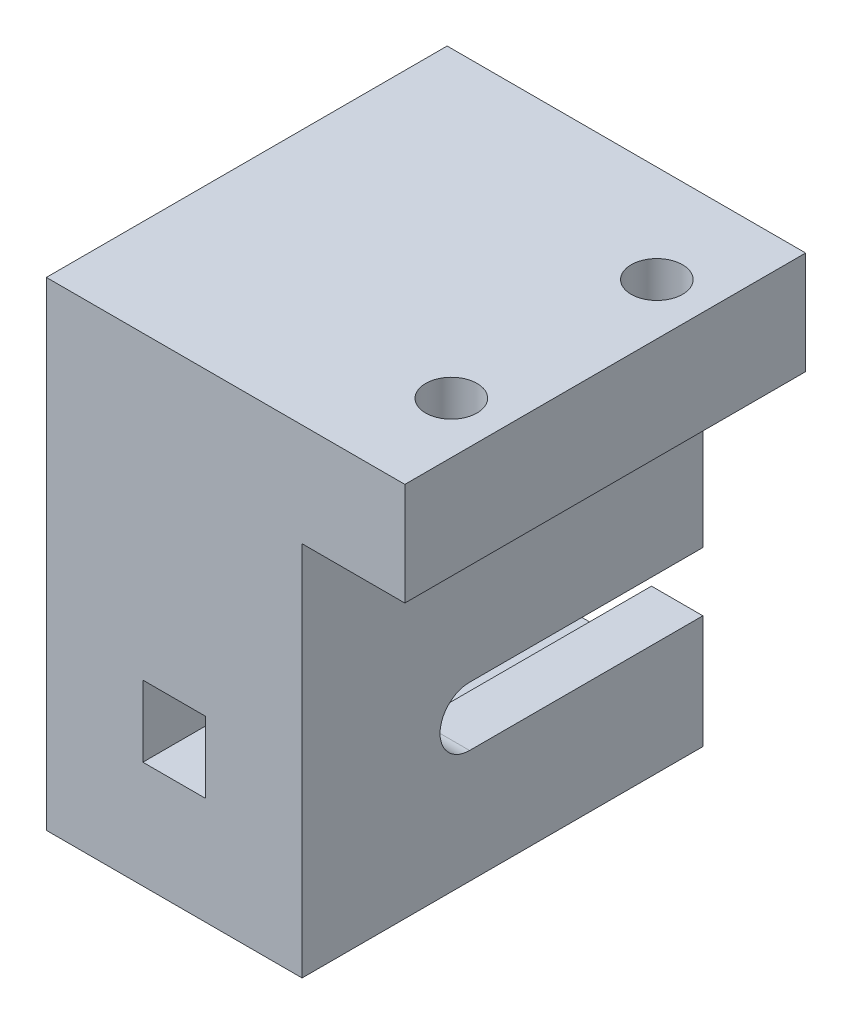
ISO-10303-21;
HEADER;
FILE_DESCRIPTION(('STEP AP214'),'2;1');
FILE_NAME('part.step','',(''),(''),'','','');
FILE_SCHEMA(('AUTOMOTIVE_DESIGN { 1 0 10303 214 1 1 1 1 }'));
ENDSEC;
DATA;
#1=APPLICATION_CONTEXT('core data for automotive mechanical design processes');
#2=APPLICATION_PROTOCOL_DEFINITION('international standard','automotive_design',2000,#1);
#3=PRODUCT_CONTEXT('',#1,'mechanical');
#4=PRODUCT('Part','Part','',(#3));
#5=PRODUCT_RELATED_PRODUCT_CATEGORY('part','',(#4));
#6=PRODUCT_DEFINITION_FORMATION('','',#4);
#7=PRODUCT_DEFINITION_CONTEXT('part definition',#1,'design');
#8=PRODUCT_DEFINITION('design','',#6,#7);
#9=PRODUCT_DEFINITION_SHAPE('','',#8);
#10=(LENGTH_UNIT() NAMED_UNIT(*) SI_UNIT(.MILLI.,.METRE.));
#11=(NAMED_UNIT(*) PLANE_ANGLE_UNIT() SI_UNIT($,.RADIAN.));
#12=(NAMED_UNIT(*) SI_UNIT($,.STERADIAN.) SOLID_ANGLE_UNIT());
#13=UNCERTAINTY_MEASURE_WITH_UNIT(LENGTH_MEASURE(1.E-05),#10,'distance_accuracy_value','');
#14=(GEOMETRIC_REPRESENTATION_CONTEXT(3) GLOBAL_UNCERTAINTY_ASSIGNED_CONTEXT((#13)) GLOBAL_UNIT_ASSIGNED_CONTEXT((#10,
#11,#12)) REPRESENTATION_CONTEXT('',''));
#15=CARTESIAN_POINT('',(0.,0.,0.));
#16=DIRECTION('',(0.,0.,1.));
#17=DIRECTION('',(1.,0.,0.));
#18=AXIS2_PLACEMENT_3D('',#15,#16,#17);
#19=CARTESIAN_POINT('',(28.5,0.,0.));
#20=DIRECTION('',(1.,0.,0.));
#21=DIRECTION('',(0.,0.,-1.));
#22=AXIS2_PLACEMENT_3D('',#19,#20,#21);
#23=PLANE('',#22);
#24=DIRECTION('',(0.,-1.,0.));
#25=VECTOR('',#24,1.);
#26=CARTESIAN_POINT('',(28.5,28.826000006,49.525));
#27=LINE('',#26,#25);
#28=CARTESIAN_POINT('',(28.5,41.526000006,49.525));
#29=VERTEX_POINT('',#28);
#30=CARTESIAN_POINT('',(28.5,28.826000006,49.525));
#31=VERTEX_POINT('',#30);
#32=EDGE_CURVE('E255',#29,#31,#27,.T.);
#33=ORIENTED_EDGE('',*,*,#32,.T.);
#34=DIRECTION('',(0.,0.,1.));
#35=VECTOR('',#34,1.);
#36=CARTESIAN_POINT('',(28.5,28.826000006,49.525));
#37=LINE('',#36,#35);
#38=CARTESIAN_POINT('',(28.5,28.826000006,0.));
#39=VERTEX_POINT('',#38);
#40=EDGE_CURVE('E219',#39,#31,#37,.T.);
#41=ORIENTED_EDGE('',*,*,#40,.F.);
#42=DIRECTION('',(0.,1.,0.));
#43=VECTOR('',#42,1.);
#44=CARTESIAN_POINT('',(28.5,28.826000006,0.));
#45=LINE('',#44,#43);
#46=CARTESIAN_POINT('',(28.5,41.526000006,0.));
#47=VERTEX_POINT('',#46);
#48=EDGE_CURVE('E218',#39,#47,#45,.T.);
#49=ORIENTED_EDGE('',*,*,#48,.T.);
#50=DIRECTION('',(0.,0.,-1.));
#51=VECTOR('',#50,1.);
#52=CARTESIAN_POINT('',(28.5,41.526000006,0.));
#53=LINE('',#52,#51);
#54=EDGE_CURVE('E242',#29,#47,#53,.T.);
#55=ORIENTED_EDGE('',*,*,#54,.F.);
#56=EDGE_LOOP('',(#33,#41,#49,#55));
#57=FACE_BOUND('',#56,.T.);
#58=ADVANCED_FACE('F43',(#57),#23,.T.);
#59=CARTESIAN_POINT('',(0.,0.,0.));
#60=DIRECTION('',(0.,0.,-1.));
#61=DIRECTION('',(-1.,0.,0.));
#62=AXIS2_PLACEMENT_3D('',#59,#60,#61);
#63=PLANE('',#62);
#64=DIRECTION('',(1.,0.,0.));
#65=VECTOR('',#64,1.);
#66=CARTESIAN_POINT('',(15.8,28.826000006,0.));
#67=LINE('',#66,#65);
#68=CARTESIAN_POINT('',(15.8,28.826000006,0.));
#69=VERTEX_POINT('',#68);
#70=EDGE_CURVE('E210',#69,#39,#67,.T.);
#71=ORIENTED_EDGE('',*,*,#70,.F.);
#72=DIRECTION('',(0.,1.,0.));
#73=VECTOR('',#72,1.);
#74=CARTESIAN_POINT('',(15.8,-17.650000006,0.));
#75=LINE('',#74,#73);
#76=CARTESIAN_POINT('',(15.8,3.65,0.));
#77=VERTEX_POINT('',#76);
#78=EDGE_CURVE('E192',#77,#69,#75,.T.);
#79=ORIENTED_EDGE('',*,*,#78,.F.);
#80=DIRECTION('',(1.,0.,0.));
#81=VECTOR('',#80,1.);
#82=CARTESIAN_POINT('',(-15.95,3.65,0.));
#83=LINE('',#82,#81);
#84=CARTESIAN_POINT('',(9.45,3.65,0.));
#85=VERTEX_POINT('',#84);
#86=EDGE_CURVE('E270',#85,#77,#83,.T.);
#87=ORIENTED_EDGE('',*,*,#86,.F.);
#88=DIRECTION('',(0.,1.,0.));
#89=VECTOR('',#88,1.);
#90=CARTESIAN_POINT('',(9.45,-11.300000006,0.));
#91=LINE('',#90,#89);
#92=CARTESIAN_POINT('',(9.45,11.300000006,0.));
#93=VERTEX_POINT('',#92);
#94=EDGE_CURVE('E312',#85,#93,#91,.T.);
#95=ORIENTED_EDGE('',*,*,#94,.T.);
#96=DIRECTION('',(-1.,0.,0.));
#97=VECTOR('',#96,1.);
#98=CARTESIAN_POINT('',(-9.45,11.300000006,0.));
#99=LINE('',#98,#97);
#100=CARTESIAN_POINT('',(-9.45,11.300000006,0.));
#101=VERTEX_POINT('',#100);
#102=EDGE_CURVE('E330',#93,#101,#99,.T.);
#103=ORIENTED_EDGE('',*,*,#102,.T.);
#104=DIRECTION('',(0.,-1.,0.));
#105=VECTOR('',#104,1.);
#106=CARTESIAN_POINT('',(-9.45,-11.300000006,0.));
#107=LINE('',#106,#105);
#108=CARTESIAN_POINT('',(-9.45,3.65,0.));
#109=VERTEX_POINT('',#108);
#110=EDGE_CURVE('E334',#101,#109,#107,.T.);
#111=ORIENTED_EDGE('',*,*,#110,.T.);
#112=CARTESIAN_POINT('',(-15.8,3.65,0.));
#113=VERTEX_POINT('',#112);
#114=EDGE_CURVE('E269',#113,#109,#83,.T.);
#115=ORIENTED_EDGE('',*,*,#114,.F.);
#116=DIRECTION('',(0.,-1.,0.));
#117=VECTOR('',#116,1.);
#118=CARTESIAN_POINT('',(-15.8,-17.650000006,0.));
#119=LINE('',#118,#117);
#120=CARTESIAN_POINT('',(-15.8,41.526000006,0.));
#121=VERTEX_POINT('',#120);
#122=EDGE_CURVE('E350',#121,#113,#119,.T.);
#123=ORIENTED_EDGE('',*,*,#122,.F.);
#124=DIRECTION('',(-1.,0.,0.));
#125=VECTOR('',#124,1.);
#126=CARTESIAN_POINT('',(-15.8,41.526000006,0.));
#127=LINE('',#126,#125);
#128=EDGE_CURVE('E245',#47,#121,#127,.T.);
#129=ORIENTED_EDGE('',*,*,#128,.F.);
#130=ORIENTED_EDGE('',*,*,#48,.F.);
#131=EDGE_LOOP('',(#71,#79,#87,#95,#103,#111,#115,#123,#129,#130));
#132=FACE_BOUND('',#131,.T.);
#133=ADVANCED_FACE('F216',(#132),#63,.T.);
#134=CARTESIAN_POINT('',(0.,0.,40.));
#135=DIRECTION('',(0.,0.,1.));
#136=DIRECTION('',(1.,0.,0.));
#137=AXIS2_PLACEMENT_3D('',#134,#135,#136);
#138=PLANE('',#137);
#139=DIRECTION('',(0.,1.,0.));
#140=VECTOR('',#139,1.);
#141=CARTESIAN_POINT('',(9.45,-11.300000006,40.));
#142=LINE('',#141,#140);
#143=CARTESIAN_POINT('',(9.45,-11.300000006,40.));
#144=VERTEX_POINT('',#143);
#145=CARTESIAN_POINT('',(9.45,11.300000006,40.));
#146=VERTEX_POINT('',#145);
#147=EDGE_CURVE('E313',#144,#146,#142,.T.);
#148=ORIENTED_EDGE('',*,*,#147,.F.);
#149=DIRECTION('',(1.,0.,0.));
#150=VECTOR('',#149,1.);
#151=CARTESIAN_POINT('',(-9.45,-11.300000006,40.));
#152=LINE('',#151,#150);
#153=CARTESIAN_POINT('',(-9.45,-11.300000006,40.));
#154=VERTEX_POINT('',#153);
#155=EDGE_CURVE('E323',#154,#144,#152,.T.);
#156=ORIENTED_EDGE('',*,*,#155,.F.);
#157=DIRECTION('',(0.,-1.,0.));
#158=VECTOR('',#157,1.);
#159=CARTESIAN_POINT('',(-9.45,-11.300000006,40.));
#160=LINE('',#159,#158);
#161=CARTESIAN_POINT('',(-9.45,11.300000006,40.));
#162=VERTEX_POINT('',#161);
#163=EDGE_CURVE('E320',#162,#154,#160,.T.);
#164=ORIENTED_EDGE('',*,*,#163,.F.);
#165=DIRECTION('',(-1.,0.,0.));
#166=VECTOR('',#165,1.);
#167=CARTESIAN_POINT('',(-9.45,11.300000006,40.));
#168=LINE('',#167,#166);
#169=EDGE_CURVE('E316',#146,#162,#168,.T.);
#170=ORIENTED_EDGE('',*,*,#169,.F.);
#171=EDGE_LOOP('',(#148,#156,#164,#170));
#172=FACE_BOUND('',#171,.T.);
#173=DIRECTION('',(0.,1.,0.));
#174=VECTOR('',#173,1.);
#175=CARTESIAN_POINT('',(-3.8745434853159,4.39429931871205,40.));
#176=LINE('',#175,#174);
#177=CARTESIAN_POINT('',(-3.8745434853159,-4.39429931871205,40.));
#178=VERTEX_POINT('',#177);
#179=CARTESIAN_POINT('',(-3.8745434853159,4.39429931871205,40.));
#180=VERTEX_POINT('',#179);
#181=EDGE_CURVE('E285',#178,#180,#176,.T.);
#182=ORIENTED_EDGE('',*,*,#181,.F.);
#183=DIRECTION('',(-1.,0.,0.));
#184=VECTOR('',#183,1.);
#185=CARTESIAN_POINT('',(3.8745434853159,-4.39429931871205,40.));
#186=LINE('',#185,#184);
#187=CARTESIAN_POINT('',(3.8745434853159,-4.39429931871205,40.));
#188=VERTEX_POINT('',#187);
#189=EDGE_CURVE('E293',#188,#178,#186,.T.);
#190=ORIENTED_EDGE('',*,*,#189,.F.);
#191=DIRECTION('',(0.,-1.,0.));
#192=VECTOR('',#191,1.);
#193=CARTESIAN_POINT('',(3.8745434853159,4.39429931871205,40.));
#194=LINE('',#193,#192);
#195=CARTESIAN_POINT('',(3.8745434853159,4.39429931871205,40.));
#196=VERTEX_POINT('',#195);
#197=EDGE_CURVE('E291',#196,#188,#194,.T.);
#198=ORIENTED_EDGE('',*,*,#197,.F.);
#199=DIRECTION('',(1.,0.,0.));
#200=VECTOR('',#199,1.);
#201=CARTESIAN_POINT('',(3.8745434853159,4.39429931871205,40.));
#202=LINE('',#201,#200);
#203=EDGE_CURVE('E288',#180,#196,#202,.T.);
#204=ORIENTED_EDGE('',*,*,#203,.F.);
#205=EDGE_LOOP('',(#182,#190,#198,#204));
#206=FACE_BOUND('',#205,.T.);
#207=ADVANCED_FACE('F391',(#172,#206),#138,.F.);
#208=DIRECTION('',(1.,0.,0.));
#209=VECTOR('',#208,1.);
#210=CARTESIAN_POINT('',(-15.95,-3.65,0.));
#211=LINE('',#210,#209);
#212=CARTESIAN_POINT('',(9.45,-3.65,0.));
#213=VERTEX_POINT('',#212);
#214=CARTESIAN_POINT('',(15.8,-3.65,0.));
#215=VERTEX_POINT('',#214);
#216=EDGE_CURVE('E65',#213,#215,#211,.T.);
#217=ORIENTED_EDGE('',*,*,#216,.T.);
#218=CARTESIAN_POINT('',(15.8,-17.650000006,0.));
#219=VERTEX_POINT('',#218);
#220=EDGE_CURVE('E204',#219,#215,#75,.T.);
#221=ORIENTED_EDGE('',*,*,#220,.F.);
#222=DIRECTION('',(1.,0.,0.));
#223=VECTOR('',#222,1.);
#224=CARTESIAN_POINT('',(-15.8,-17.650000006,0.));
#225=LINE('',#224,#223);
#226=CARTESIAN_POINT('',(-15.8,-17.650000006,0.));
#227=VERTEX_POINT('',#226);
#228=EDGE_CURVE('E205',#227,#219,#225,.T.);
#229=ORIENTED_EDGE('',*,*,#228,.F.);
#230=CARTESIAN_POINT('',(-15.8,-3.65,0.));
#231=VERTEX_POINT('',#230);
#232=EDGE_CURVE('E349',#231,#227,#119,.T.);
#233=ORIENTED_EDGE('',*,*,#232,.F.);
#234=CARTESIAN_POINT('',(-9.45,-3.65,0.));
#235=VERTEX_POINT('',#234);
#236=EDGE_CURVE('E272',#231,#235,#211,.T.);
#237=ORIENTED_EDGE('',*,*,#236,.T.);
#238=CARTESIAN_POINT('',(-9.45,-11.300000006,0.));
#239=VERTEX_POINT('',#238);
#240=EDGE_CURVE('E333',#235,#239,#107,.T.);
#241=ORIENTED_EDGE('',*,*,#240,.T.);
#242=DIRECTION('',(1.,0.,0.));
#243=VECTOR('',#242,1.);
#244=CARTESIAN_POINT('',(-9.45,-11.300000006,0.));
#245=LINE('',#244,#243);
#246=CARTESIAN_POINT('',(9.45,-11.300000006,0.));
#247=VERTEX_POINT('',#246);
#248=EDGE_CURVE('E317',#239,#247,#245,.T.);
#249=ORIENTED_EDGE('',*,*,#248,.T.);
#250=EDGE_CURVE('E327',#247,#213,#91,.T.);
#251=ORIENTED_EDGE('',*,*,#250,.T.);
#252=EDGE_LOOP('',(#217,#221,#229,#233,#237,#241,#249,#251));
#253=FACE_BOUND('',#252,.T.);
#254=ADVANCED_FACE('F400',(#253),#63,.T.);
#255=CARTESIAN_POINT('',(-15.8,-17.650000006,40.));
#256=DIRECTION('',(1.,0.,0.));
#257=DIRECTION('',(0.,0.,-1.));
#258=AXIS2_PLACEMENT_3D('',#255,#256,#257);
#259=PLANE('',#258);
#260=DIRECTION('',(0.,0.,1.));
#261=VECTOR('',#260,1.);
#262=CARTESIAN_POINT('',(-15.8,3.65,40.));
#263=LINE('',#262,#261);
#264=CARTESIAN_POINT('',(-15.8,3.65,23.6314235617938));
#265=VERTEX_POINT('',#264);
#266=EDGE_CURVE('E280',#113,#265,#263,.T.);
#267=ORIENTED_EDGE('',*,*,#266,.T.);
#268=CARTESIAN_POINT('',(-15.8,0.,28.8275759845004));
#269=DIRECTION('',(-1.,0.,0.));
#270=DIRECTION('',(0.,0.,1.));
#271=AXIS2_PLACEMENT_3D('',#268,#269,#270);
#272=CIRCLE('',#271,6.35);
#273=CARTESIAN_POINT('',(-15.8,-3.65,23.6314235617938));
#274=VERTEX_POINT('',#273);
#275=EDGE_CURVE('E58',#274,#265,#272,.T.);
#276=ORIENTED_EDGE('',*,*,#275,.F.);
#277=DIRECTION('',(0.,0.,-1.));
#278=VECTOR('',#277,1.);
#279=CARTESIAN_POINT('',(-15.8,-3.65,40.));
#280=LINE('',#279,#278);
#281=EDGE_CURVE('E276',#274,#231,#280,.T.);
#282=ORIENTED_EDGE('',*,*,#281,.T.);
#283=ORIENTED_EDGE('',*,*,#232,.T.);
#284=DIRECTION('',(0.,0.,-1.));
#285=VECTOR('',#284,1.);
#286=CARTESIAN_POINT('',(-15.8,-17.650000006,40.));
#287=LINE('',#286,#285);
#288=CARTESIAN_POINT('',(-15.8,-17.650000006,49.525));
#289=VERTEX_POINT('',#288);
#290=EDGE_CURVE('E357',#289,#227,#287,.T.);
#291=ORIENTED_EDGE('',*,*,#290,.F.);
#292=DIRECTION('',(0.,-1.,0.));
#293=VECTOR('',#292,1.);
#294=CARTESIAN_POINT('',(-15.8,0.,49.525));
#295=LINE('',#294,#293);
#296=CARTESIAN_POINT('',(-15.8,41.526000006,49.525));
#297=VERTEX_POINT('',#296);
#298=EDGE_CURVE('E299',#297,#289,#295,.T.);
#299=ORIENTED_EDGE('',*,*,#298,.F.);
#300=DIRECTION('',(0.,0.,1.));
#301=VECTOR('',#300,1.);
#302=CARTESIAN_POINT('',(-15.8,41.526000006,0.));
#303=LINE('',#302,#301);
#304=EDGE_CURVE('E234',#121,#297,#303,.T.);
#305=ORIENTED_EDGE('',*,*,#304,.F.);
#306=ORIENTED_EDGE('',*,*,#122,.T.);
#307=EDGE_LOOP('',(#267,#276,#282,#283,#291,#299,#305,#306));
#308=FACE_BOUND('',#307,.T.);
#309=ADVANCED_FACE('F45',(#308),#259,.F.);
#310=CARTESIAN_POINT('',(-15.8,-17.650000006,40.));
#311=DIRECTION('',(0.,1.,0.));
#312=DIRECTION('',(0.,0.,1.));
#313=AXIS2_PLACEMENT_3D('',#310,#311,#312);
#314=PLANE('',#313);
#315=ORIENTED_EDGE('',*,*,#228,.T.);
#316=DIRECTION('',(0.,0.,-1.));
#317=VECTOR('',#316,1.);
#318=CARTESIAN_POINT('',(15.8,-17.650000006,40.));
#319=LINE('',#318,#317);
#320=CARTESIAN_POINT('',(15.8,-17.650000006,49.525));
#321=VERTEX_POINT('',#320);
#322=EDGE_CURVE('E354',#321,#219,#319,.T.);
#323=ORIENTED_EDGE('',*,*,#322,.F.);
#324=DIRECTION('',(1.,0.,0.));
#325=VECTOR('',#324,1.);
#326=CARTESIAN_POINT('',(0.,-17.650000006,49.525));
#327=LINE('',#326,#325);
#328=EDGE_CURVE('E307',#289,#321,#327,.T.);
#329=ORIENTED_EDGE('',*,*,#328,.F.);
#330=ORIENTED_EDGE('',*,*,#290,.T.);
#331=EDGE_LOOP('',(#315,#323,#329,#330));
#332=FACE_BOUND('',#331,.T.);
#333=ADVANCED_FACE('F485',(#332),#314,.F.);
#334=CARTESIAN_POINT('',(15.8,-17.650000006,40.));
#335=DIRECTION('',(-1.,0.,0.));
#336=DIRECTION('',(0.,0.,1.));
#337=AXIS2_PLACEMENT_3D('',#334,#335,#336);
#338=PLANE('',#337);
#339=ORIENTED_EDGE('',*,*,#78,.T.);
#340=DIRECTION('',(0.,0.,-1.));
#341=VECTOR('',#340,1.);
#342=CARTESIAN_POINT('',(15.8,28.826000006,49.525));
#343=LINE('',#342,#341);
#344=CARTESIAN_POINT('',(15.8,28.826000006,49.525));
#345=VERTEX_POINT('',#344);
#346=EDGE_CURVE('E196',#345,#69,#343,.T.);
#347=ORIENTED_EDGE('',*,*,#346,.F.);
#348=DIRECTION('',(0.,1.,0.));
#349=VECTOR('',#348,1.);
#350=CARTESIAN_POINT('',(15.8,0.,49.525));
#351=LINE('',#350,#349);
#352=EDGE_CURVE('E310',#321,#345,#351,.T.);
#353=ORIENTED_EDGE('',*,*,#352,.F.);
#354=ORIENTED_EDGE('',*,*,#322,.T.);
#355=ORIENTED_EDGE('',*,*,#220,.T.);
#356=DIRECTION('',(0.,0.,-1.));
#357=VECTOR('',#356,1.);
#358=CARTESIAN_POINT('',(15.8,-3.65,0.));
#359=LINE('',#358,#357);
#360=CARTESIAN_POINT('',(15.8,-3.65,28.8275759845004));
#361=VERTEX_POINT('',#360);
#362=EDGE_CURVE('E262',#361,#215,#359,.T.);
#363=ORIENTED_EDGE('',*,*,#362,.F.);
#364=CARTESIAN_POINT('',(15.8,0.,28.8275759845004));
#365=DIRECTION('',(1.,0.,0.));
#366=DIRECTION('',(0.,0.,-1.));
#367=AXIS2_PLACEMENT_3D('',#364,#365,#366);
#368=CIRCLE('',#367,3.65);
#369=CARTESIAN_POINT('',(15.8,3.65,28.8275759845004));
#370=VERTEX_POINT('',#369);
#371=EDGE_CURVE('E259',#370,#361,#368,.T.);
#372=ORIENTED_EDGE('',*,*,#371,.F.);
#373=DIRECTION('',(0.,0.,1.));
#374=VECTOR('',#373,1.);
#375=CARTESIAN_POINT('',(15.8,3.65,28.8275759845004));
#376=LINE('',#375,#374);
#377=EDGE_CURVE('E200',#77,#370,#376,.T.);
#378=ORIENTED_EDGE('',*,*,#377,.F.);
#379=EDGE_LOOP('',(#339,#347,#353,#354,#355,#363,#372,#378));
#380=FACE_BOUND('',#379,.T.);
#381=ADVANCED_FACE('F194',(#380),#338,.F.);
#382=CARTESIAN_POINT('',(9.45,-11.300000006,40.));
#383=DIRECTION('',(-1.,0.,0.));
#384=DIRECTION('',(0.,0.,1.));
#385=AXIS2_PLACEMENT_3D('',#382,#383,#384);
#386=PLANE('',#385);
#387=DIRECTION('',(0.,0.,-1.));
#388=VECTOR('',#387,1.);
#389=CARTESIAN_POINT('',(9.45,3.65,40.));
#390=LINE('',#389,#388);
#391=CARTESIAN_POINT('',(9.45,3.65,28.8275759845004));
#392=VERTEX_POINT('',#391);
#393=EDGE_CURVE('E278',#392,#85,#390,.T.);
#394=ORIENTED_EDGE('',*,*,#393,.F.);
#395=CARTESIAN_POINT('',(9.45,0.,28.8275759845004));
#396=DIRECTION('',(-1.,0.,0.));
#397=DIRECTION('',(0.,0.,1.));
#398=AXIS2_PLACEMENT_3D('',#395,#396,#397);
#399=CIRCLE('',#398,3.65);
#400=CARTESIAN_POINT('',(9.45,-3.65,28.8275759845004));
#401=VERTEX_POINT('',#400);
#402=EDGE_CURVE('E283',#401,#392,#399,.T.);
#403=ORIENTED_EDGE('',*,*,#402,.F.);
#404=DIRECTION('',(0.,0.,1.));
#405=VECTOR('',#404,1.);
#406=CARTESIAN_POINT('',(9.45,-3.65,40.));
#407=LINE('',#406,#405);
#408=EDGE_CURVE('E268',#213,#401,#407,.T.);
#409=ORIENTED_EDGE('',*,*,#408,.F.);
#410=ORIENTED_EDGE('',*,*,#250,.F.);
#411=DIRECTION('',(0.,0.,-1.));
#412=VECTOR('',#411,1.);
#413=CARTESIAN_POINT('',(9.45,-11.300000006,40.));
#414=LINE('',#413,#412);
#415=EDGE_CURVE('E326',#144,#247,#414,.T.);
#416=ORIENTED_EDGE('',*,*,#415,.F.);
#417=ORIENTED_EDGE('',*,*,#147,.T.);
#418=DIRECTION('',(0.,0.,-1.));
#419=VECTOR('',#418,1.);
#420=CARTESIAN_POINT('',(9.45,11.300000006,40.));
#421=LINE('',#420,#419);
#422=EDGE_CURVE('E346',#146,#93,#421,.T.);
#423=ORIENTED_EDGE('',*,*,#422,.T.);
#424=ORIENTED_EDGE('',*,*,#94,.F.);
#425=EDGE_LOOP('',(#394,#403,#409,#410,#416,#417,#423,#424));
#426=FACE_BOUND('',#425,.T.);
#427=ADVANCED_FACE('F388',(#426),#386,.T.);
#428=CARTESIAN_POINT('',(-9.45,11.300000006,40.));
#429=DIRECTION('',(0.,-1.,0.));
#430=DIRECTION('',(0.,0.,-1.));
#431=AXIS2_PLACEMENT_3D('',#428,#429,#430);
#432=PLANE('',#431);
#433=ORIENTED_EDGE('',*,*,#102,.F.);
#434=ORIENTED_EDGE('',*,*,#422,.F.);
#435=ORIENTED_EDGE('',*,*,#169,.T.);
#436=DIRECTION('',(0.,0.,-1.));
#437=VECTOR('',#436,1.);
#438=CARTESIAN_POINT('',(-9.45,11.300000006,40.));
#439=LINE('',#438,#437);
#440=EDGE_CURVE('E344',#162,#101,#439,.T.);
#441=ORIENTED_EDGE('',*,*,#440,.T.);
#442=EDGE_LOOP('',(#433,#434,#435,#441));
#443=FACE_BOUND('',#442,.T.);
#444=ADVANCED_FACE('F385',(#443),#432,.T.);
#445=CARTESIAN_POINT('',(-9.45,-11.300000006,40.));
#446=DIRECTION('',(1.,0.,0.));
#447=DIRECTION('',(0.,0.,-1.));
#448=AXIS2_PLACEMENT_3D('',#445,#446,#447);
#449=PLANE('',#448);
#450=CARTESIAN_POINT('',(-9.45,0.,28.8275759845004));
#451=DIRECTION('',(-1.,0.,0.));
#452=DIRECTION('',(0.,0.,1.));
#453=AXIS2_PLACEMENT_3D('',#450,#451,#452);
#454=CIRCLE('',#453,6.35);
#455=CARTESIAN_POINT('',(-9.45,-3.65,23.6314235617938));
#456=VERTEX_POINT('',#455);
#457=CARTESIAN_POINT('',(-9.45,3.65,23.6314235617938));
#458=VERTEX_POINT('',#457);
#459=EDGE_CURVE('E248',#456,#458,#454,.T.);
#460=ORIENTED_EDGE('',*,*,#459,.T.);
#461=DIRECTION('',(0.,0.,1.));
#462=VECTOR('',#461,1.);
#463=CARTESIAN_POINT('',(-9.45,3.65,40.));
#464=LINE('',#463,#462);
#465=EDGE_CURVE('E51',#109,#458,#464,.T.);
#466=ORIENTED_EDGE('',*,*,#465,.F.);
#467=ORIENTED_EDGE('',*,*,#110,.F.);
#468=ORIENTED_EDGE('',*,*,#440,.F.);
#469=ORIENTED_EDGE('',*,*,#163,.T.);
#470=DIRECTION('',(0.,0.,-1.));
#471=VECTOR('',#470,1.);
#472=CARTESIAN_POINT('',(-9.45,-11.300000006,40.));
#473=LINE('',#472,#471);
#474=EDGE_CURVE('E341',#154,#239,#473,.T.);
#475=ORIENTED_EDGE('',*,*,#474,.T.);
#476=ORIENTED_EDGE('',*,*,#240,.F.);
#477=DIRECTION('',(0.,0.,-1.));
#478=VECTOR('',#477,1.);
#479=CARTESIAN_POINT('',(-9.45,-3.65,40.));
#480=LINE('',#479,#478);
#481=EDGE_CURVE('E369',#456,#235,#480,.T.);
#482=ORIENTED_EDGE('',*,*,#481,.F.);
#483=EDGE_LOOP('',(#460,#466,#467,#468,#469,#475,#476,#482));
#484=FACE_BOUND('',#483,.T.);
#485=ADVANCED_FACE('F378',(#484),#449,.T.);
#486=CARTESIAN_POINT('',(-9.45,-11.300000006,40.));
#487=DIRECTION('',(0.,1.,0.));
#488=DIRECTION('',(0.,0.,1.));
#489=AXIS2_PLACEMENT_3D('',#486,#487,#488);
#490=PLANE('',#489);
#491=ORIENTED_EDGE('',*,*,#248,.F.);
#492=ORIENTED_EDGE('',*,*,#474,.F.);
#493=ORIENTED_EDGE('',*,*,#155,.T.);
#494=ORIENTED_EDGE('',*,*,#415,.T.);
#495=EDGE_LOOP('',(#491,#492,#493,#494));
#496=FACE_BOUND('',#495,.T.);
#497=ADVANCED_FACE('F396',(#496),#490,.T.);
#498=CARTESIAN_POINT('',(0.,0.,49.525));
#499=DIRECTION('',(0.,0.,1.));
#500=DIRECTION('',(1.,0.,0.));
#501=AXIS2_PLACEMENT_3D('',#498,#499,#500);
#502=PLANE('',#501);
#503=ORIENTED_EDGE('',*,*,#352,.T.);
#504=DIRECTION('',(-1.,0.,0.));
#505=VECTOR('',#504,1.);
#506=CARTESIAN_POINT('',(15.8,28.826000006,49.525));
#507=LINE('',#506,#505);
#508=EDGE_CURVE('E213',#31,#345,#507,.T.);
#509=ORIENTED_EDGE('',*,*,#508,.F.);
#510=ORIENTED_EDGE('',*,*,#32,.F.);
#511=DIRECTION('',(1.,0.,0.));
#512=VECTOR('',#511,1.);
#513=CARTESIAN_POINT('',(-15.8,41.526000006,49.525));
#514=LINE('',#513,#512);
#515=EDGE_CURVE('E239',#297,#29,#514,.T.);
#516=ORIENTED_EDGE('',*,*,#515,.F.);
#517=ORIENTED_EDGE('',*,*,#298,.T.);
#518=ORIENTED_EDGE('',*,*,#328,.T.);
#519=EDGE_LOOP('',(#503,#509,#510,#516,#517,#518));
#520=FACE_BOUND('',#519,.T.);
#521=DIRECTION('',(0.,-1.,0.));
#522=VECTOR('',#521,1.);
#523=CARTESIAN_POINT('',(-3.8745434853159,0.,49.525));
#524=LINE('',#523,#522);
#525=CARTESIAN_POINT('',(-3.8745434853159,4.39429931871205,49.525));
#526=VERTEX_POINT('',#525);
#527=CARTESIAN_POINT('',(-3.8745434853159,-4.39429931871205,49.525));
#528=VERTEX_POINT('',#527);
#529=EDGE_CURVE('E367',#526,#528,#524,.T.);
#530=ORIENTED_EDGE('',*,*,#529,.F.);
#531=DIRECTION('',(-1.,0.,0.));
#532=VECTOR('',#531,1.);
#533=CARTESIAN_POINT('',(0.,4.39429931871205,49.525));
#534=LINE('',#533,#532);
#535=CARTESIAN_POINT('',(3.8745434853159,4.39429931871205,49.525));
#536=VERTEX_POINT('',#535);
#537=EDGE_CURVE('E360',#536,#526,#534,.T.);
#538=ORIENTED_EDGE('',*,*,#537,.F.);
#539=DIRECTION('',(0.,1.,0.));
#540=VECTOR('',#539,1.);
#541=CARTESIAN_POINT('',(3.8745434853159,0.,49.525));
#542=LINE('',#541,#540);
#543=CARTESIAN_POINT('',(3.8745434853159,-4.39429931871205,49.525));
#544=VERTEX_POINT('',#543);
#545=EDGE_CURVE('E362',#544,#536,#542,.T.);
#546=ORIENTED_EDGE('',*,*,#545,.F.);
#547=DIRECTION('',(1.,0.,0.));
#548=VECTOR('',#547,1.);
#549=CARTESIAN_POINT('',(0.,-4.39429931871205,49.525));
#550=LINE('',#549,#548);
#551=EDGE_CURVE('E365',#528,#544,#550,.T.);
#552=ORIENTED_EDGE('',*,*,#551,.F.);
#553=EDGE_LOOP('',(#530,#538,#546,#552));
#554=FACE_BOUND('',#553,.T.);
#555=ADVANCED_FACE('F417',(#520,#554),#502,.T.);
#556=CARTESIAN_POINT('',(-3.8745434853159,4.39429931871205,52.7));
#557=DIRECTION('',(-1.,0.,0.));
#558=DIRECTION('',(0.,0.,1.));
#559=AXIS2_PLACEMENT_3D('',#556,#557,#558);
#560=PLANE('',#559);
#561=ORIENTED_EDGE('',*,*,#529,.T.);
#562=DIRECTION('',(0.,0.,-1.));
#563=VECTOR('',#562,1.);
#564=CARTESIAN_POINT('',(-3.8745434853159,-4.39429931871205,52.7));
#565=LINE('',#564,#563);
#566=EDGE_CURVE('E297',#528,#178,#565,.T.);
#567=ORIENTED_EDGE('',*,*,#566,.T.);
#568=ORIENTED_EDGE('',*,*,#181,.T.);
#569=DIRECTION('',(0.,0.,-1.));
#570=VECTOR('',#569,1.);
#571=CARTESIAN_POINT('',(-3.8745434853159,4.39429931871205,52.7));
#572=LINE('',#571,#570);
#573=EDGE_CURVE('E296',#526,#180,#572,.T.);
#574=ORIENTED_EDGE('',*,*,#573,.F.);
#575=EDGE_LOOP('',(#561,#567,#568,#574));
#576=FACE_BOUND('',#575,.T.);
#577=ADVANCED_FACE('F567',(#576),#560,.F.);
#578=CARTESIAN_POINT('',(3.8745434853159,-4.39429931871205,52.7));
#579=DIRECTION('',(0.,-1.,0.));
#580=DIRECTION('',(0.,0.,-1.));
#581=AXIS2_PLACEMENT_3D('',#578,#579,#580);
#582=PLANE('',#581);
#583=ORIENTED_EDGE('',*,*,#551,.T.);
#584=DIRECTION('',(0.,0.,-1.));
#585=VECTOR('',#584,1.);
#586=CARTESIAN_POINT('',(3.8745434853159,-4.39429931871205,52.7));
#587=LINE('',#586,#585);
#588=EDGE_CURVE('E300',#544,#188,#587,.T.);
#589=ORIENTED_EDGE('',*,*,#588,.T.);
#590=ORIENTED_EDGE('',*,*,#189,.T.);
#591=ORIENTED_EDGE('',*,*,#566,.F.);
#592=EDGE_LOOP('',(#583,#589,#590,#591));
#593=FACE_BOUND('',#592,.T.);
#594=ADVANCED_FACE('F612',(#593),#582,.F.);
#595=CARTESIAN_POINT('',(3.8745434853159,4.39429931871205,52.7));
#596=DIRECTION('',(1.,0.,0.));
#597=DIRECTION('',(0.,0.,-1.));
#598=AXIS2_PLACEMENT_3D('',#595,#596,#597);
#599=PLANE('',#598);
#600=ORIENTED_EDGE('',*,*,#545,.T.);
#601=DIRECTION('',(0.,0.,-1.));
#602=VECTOR('',#601,1.);
#603=CARTESIAN_POINT('',(3.8745434853159,4.39429931871205,52.7));
#604=LINE('',#603,#602);
#605=EDGE_CURVE('E303',#536,#196,#604,.T.);
#606=ORIENTED_EDGE('',*,*,#605,.T.);
#607=ORIENTED_EDGE('',*,*,#197,.T.);
#608=ORIENTED_EDGE('',*,*,#588,.F.);
#609=EDGE_LOOP('',(#600,#606,#607,#608));
#610=FACE_BOUND('',#609,.T.);
#611=ADVANCED_FACE('F622',(#610),#599,.F.);
#612=CARTESIAN_POINT('',(3.8745434853159,4.39429931871205,52.7));
#613=DIRECTION('',(0.,1.,0.));
#614=DIRECTION('',(0.,0.,1.));
#615=AXIS2_PLACEMENT_3D('',#612,#613,#614);
#616=PLANE('',#615);
#617=ORIENTED_EDGE('',*,*,#537,.T.);
#618=ORIENTED_EDGE('',*,*,#573,.T.);
#619=ORIENTED_EDGE('',*,*,#203,.T.);
#620=ORIENTED_EDGE('',*,*,#605,.F.);
#621=EDGE_LOOP('',(#617,#618,#619,#620));
#622=FACE_BOUND('',#621,.T.);
#623=ADVANCED_FACE('F506',(#622),#616,.F.);
#624=CARTESIAN_POINT('',(-15.95,-3.65,0.));
#625=DIRECTION('',(0.,-1.,0.));
#626=DIRECTION('',(0.,0.,-1.));
#627=AXIS2_PLACEMENT_3D('',#624,#625,#626);
#628=PLANE('',#627);
#629=ORIENTED_EDGE('',*,*,#281,.F.);
#630=DIRECTION('',(-1.,0.,0.));
#631=VECTOR('',#630,1.);
#632=CARTESIAN_POINT('',(-9.45,-3.65,23.6314235617938));
#633=LINE('',#632,#631);
#634=EDGE_CURVE('E251',#274,#456,#633,.F.);
#635=ORIENTED_EDGE('',*,*,#634,.T.);
#636=ORIENTED_EDGE('',*,*,#481,.T.);
#637=ORIENTED_EDGE('',*,*,#236,.F.);
#638=EDGE_LOOP('',(#629,#635,#636,#637));
#639=FACE_BOUND('',#638,.T.);
#640=ADVANCED_FACE('F406',(#639),#628,.F.);
#641=CARTESIAN_POINT('',(-15.95,3.65,28.8275759845004));
#642=DIRECTION('',(0.,1.,0.));
#643=DIRECTION('',(0.,0.,1.));
#644=AXIS2_PLACEMENT_3D('',#641,#642,#643);
#645=PLANE('',#644);
#646=ORIENTED_EDGE('',*,*,#465,.T.);
#647=DIRECTION('',(-1.,0.,0.));
#648=VECTOR('',#647,1.);
#649=CARTESIAN_POINT('',(-9.45,3.65,23.6314235617938));
#650=LINE('',#649,#648);
#651=EDGE_CURVE('E11',#458,#265,#650,.T.);
#652=ORIENTED_EDGE('',*,*,#651,.T.);
#653=ORIENTED_EDGE('',*,*,#266,.F.);
#654=ORIENTED_EDGE('',*,*,#114,.T.);
#655=EDGE_LOOP('',(#646,#652,#653,#654));
#656=FACE_BOUND('',#655,.T.);
#657=ADVANCED_FACE('F373',(#656),#645,.F.);
#658=CARTESIAN_POINT('',(-15.95,0.,28.8275759845004));
#659=DIRECTION('',(1.,0.,0.));
#660=DIRECTION('',(0.,0.,-1.));
#661=AXIS2_PLACEMENT_3D('',#658,#659,#660);
#662=CYLINDRICAL_SURFACE('',#661,3.65);
#663=ORIENTED_EDGE('',*,*,#402,.T.);
#664=DIRECTION('',(1.,0.,0.));
#665=VECTOR('',#664,1.);
#666=CARTESIAN_POINT('',(-15.95,3.65,28.8275759845004));
#667=LINE('',#666,#665);
#668=EDGE_CURVE('E266',#392,#370,#667,.T.);
#669=ORIENTED_EDGE('',*,*,#668,.T.);
#670=ORIENTED_EDGE('',*,*,#371,.T.);
#671=DIRECTION('',(1.,0.,0.));
#672=VECTOR('',#671,1.);
#673=CARTESIAN_POINT('',(-15.95,-3.65,28.8275759845004));
#674=LINE('',#673,#672);
#675=EDGE_CURVE('E265',#401,#361,#674,.T.);
#676=ORIENTED_EDGE('',*,*,#675,.F.);
#677=EDGE_LOOP('',(#663,#669,#670,#676));
#678=FACE_BOUND('',#677,.T.);
#679=ADVANCED_FACE('F427',(#678),#662,.F.);
#680=ORIENTED_EDGE('',*,*,#393,.T.);
#681=ORIENTED_EDGE('',*,*,#86,.T.);
#682=ORIENTED_EDGE('',*,*,#377,.T.);
#683=ORIENTED_EDGE('',*,*,#668,.F.);
#684=EDGE_LOOP('',(#680,#681,#682,#683));
#685=FACE_BOUND('',#684,.T.);
#686=ADVANCED_FACE('F430',(#685),#645,.F.);
#687=ORIENTED_EDGE('',*,*,#408,.T.);
#688=ORIENTED_EDGE('',*,*,#675,.T.);
#689=ORIENTED_EDGE('',*,*,#362,.T.);
#690=ORIENTED_EDGE('',*,*,#216,.F.);
#691=EDGE_LOOP('',(#687,#688,#689,#690));
#692=FACE_BOUND('',#691,.T.);
#693=ADVANCED_FACE('F425',(#692),#628,.F.);
#694=CARTESIAN_POINT('',(-9.45,0.,28.8275759845004));
#695=DIRECTION('',(-1.,0.,0.));
#696=DIRECTION('',(0.,0.,1.));
#697=AXIS2_PLACEMENT_3D('',#694,#695,#696);
#698=CYLINDRICAL_SURFACE('',#697,6.35);
#699=ORIENTED_EDGE('',*,*,#275,.T.);
#700=ORIENTED_EDGE('',*,*,#651,.F.);
#701=ORIENTED_EDGE('',*,*,#459,.F.);
#702=ORIENTED_EDGE('',*,*,#634,.F.);
#703=EDGE_LOOP('',(#699,#700,#701,#702));
#704=FACE_BOUND('',#703,.T.);
#705=ADVANCED_FACE('F407',(#704),#698,.F.);
#706=CARTESIAN_POINT('',(0.,28.826000006,0.));
#707=DIRECTION('',(0.,1.,0.));
#708=DIRECTION('',(0.,0.,1.));
#709=AXIS2_PLACEMENT_3D('',#706,#707,#708);
#710=PLANE('',#709);
#711=CARTESIAN_POINT('',(22.15,28.826000006,37.4345724519284));
#712=DIRECTION('',(0.,1.,0.));
#713=DIRECTION('',(0.,0.,1.));
#714=AXIS2_PLACEMENT_3D('',#711,#712,#713);
#715=CIRCLE('',#714,3.175);
#716=CARTESIAN_POINT('',(22.15,28.826000006,40.6095724519284));
#717=VERTEX_POINT('',#716);
#718=EDGE_CURVE('E224',#717,#717,#715,.T.);
#719=ORIENTED_EDGE('',*,*,#718,.T.);
#720=EDGE_LOOP('',(#719));
#721=FACE_BOUND('',#720,.T.);
#722=ORIENTED_EDGE('',*,*,#346,.T.);
#723=ORIENTED_EDGE('',*,*,#70,.T.);
#724=ORIENTED_EDGE('',*,*,#40,.T.);
#725=ORIENTED_EDGE('',*,*,#508,.T.);
#726=EDGE_LOOP('',(#722,#723,#724,#725));
#727=FACE_BOUND('',#726,.T.);
#728=CARTESIAN_POINT('',(22.15,28.826000006,12.0345724519284));
#729=DIRECTION('',(0.,1.,0.));
#730=DIRECTION('',(0.,0.,1.));
#731=AXIS2_PLACEMENT_3D('',#728,#729,#730);
#732=CIRCLE('',#731,3.175);
#733=CARTESIAN_POINT('',(22.15,28.826000006,15.2095724519284));
#734=VERTEX_POINT('',#733);
#735=EDGE_CURVE('E228',#734,#734,#732,.T.);
#736=ORIENTED_EDGE('',*,*,#735,.T.);
#737=EDGE_LOOP('',(#736));
#738=FACE_BOUND('',#737,.T.);
#739=ADVANCED_FACE('F208',(#721,#727,#738),#710,.F.);
#740=CARTESIAN_POINT('',(0.,41.526000006,0.));
#741=DIRECTION('',(0.,1.,0.));
#742=DIRECTION('',(0.,0.,1.));
#743=AXIS2_PLACEMENT_3D('',#740,#741,#742);
#744=PLANE('',#743);
#745=CARTESIAN_POINT('',(22.15,41.526000006,12.0345724519284));
#746=DIRECTION('',(0.,1.,0.));
#747=DIRECTION('',(0.,0.,1.));
#748=AXIS2_PLACEMENT_3D('',#745,#746,#747);
#749=CIRCLE('',#748,3.175);
#750=CARTESIAN_POINT('',(22.15,41.526000006,15.2095724519284));
#751=VERTEX_POINT('',#750);
#752=EDGE_CURVE('E231',#751,#751,#749,.T.);
#753=ORIENTED_EDGE('',*,*,#752,.F.);
#754=EDGE_LOOP('',(#753));
#755=FACE_BOUND('',#754,.T.);
#756=ORIENTED_EDGE('',*,*,#304,.T.);
#757=ORIENTED_EDGE('',*,*,#515,.T.);
#758=ORIENTED_EDGE('',*,*,#54,.T.);
#759=ORIENTED_EDGE('',*,*,#128,.T.);
#760=EDGE_LOOP('',(#756,#757,#758,#759));
#761=FACE_BOUND('',#760,.T.);
#762=CARTESIAN_POINT('',(22.15,41.526000006,37.4345724519284));
#763=DIRECTION('',(0.,1.,0.));
#764=DIRECTION('',(0.,0.,1.));
#765=AXIS2_PLACEMENT_3D('',#762,#763,#764);
#766=CIRCLE('',#765,3.175);
#767=CARTESIAN_POINT('',(22.15,41.526000006,40.6095724519284));
#768=VERTEX_POINT('',#767);
#769=EDGE_CURVE('E225',#768,#768,#766,.T.);
#770=ORIENTED_EDGE('',*,*,#769,.F.);
#771=EDGE_LOOP('',(#770));
#772=FACE_BOUND('',#771,.T.);
#773=ADVANCED_FACE('F411',(#755,#761,#772),#744,.T.);
#774=CARTESIAN_POINT('',(22.15,41.526000006,12.0345724519284));
#775=DIRECTION('',(0.,-1.,0.));
#776=DIRECTION('',(0.,0.,-1.));
#777=AXIS2_PLACEMENT_3D('',#774,#775,#776);
#778=CYLINDRICAL_SURFACE('',#777,3.175);
#779=ORIENTED_EDGE('',*,*,#752,.T.);
#780=EDGE_LOOP('',(#779));
#781=FACE_BOUND('',#780,.T.);
#782=ORIENTED_EDGE('',*,*,#735,.F.);
#783=EDGE_LOOP('',(#782));
#784=FACE_BOUND('',#783,.T.);
#785=ADVANCED_FACE('F455',(#781,#784),#778,.F.);
#786=CARTESIAN_POINT('',(22.15,41.526000006,37.4345724519284));
#787=DIRECTION('',(0.,-1.,0.));
#788=DIRECTION('',(0.,0.,-1.));
#789=AXIS2_PLACEMENT_3D('',#786,#787,#788);
#790=CYLINDRICAL_SURFACE('',#789,3.175);
#791=ORIENTED_EDGE('',*,*,#769,.T.);
#792=EDGE_LOOP('',(#791));
#793=FACE_BOUND('',#792,.T.);
#794=ORIENTED_EDGE('',*,*,#718,.F.);
#795=EDGE_LOOP('',(#794));
#796=FACE_BOUND('',#795,.T.);
#797=ADVANCED_FACE('F459',(#793,#796),#790,.F.);
#798=CLOSED_SHELL('',(#58,#133,#207,#254,#309,#333,#381,#427,#444,#485,#497,#555,#577,#594,#611,
#623,#640,#657,#679,#686,#693,#705,#739,#773,#785,#797));
#799=MANIFOLD_SOLID_BREP('B2',#798);
#800=ADVANCED_BREP_SHAPE_REPRESENTATION('',(#18,#799),#14);
#801=SHAPE_DEFINITION_REPRESENTATION(#9,#800);
ENDSEC;
END-ISO-10303-21;
